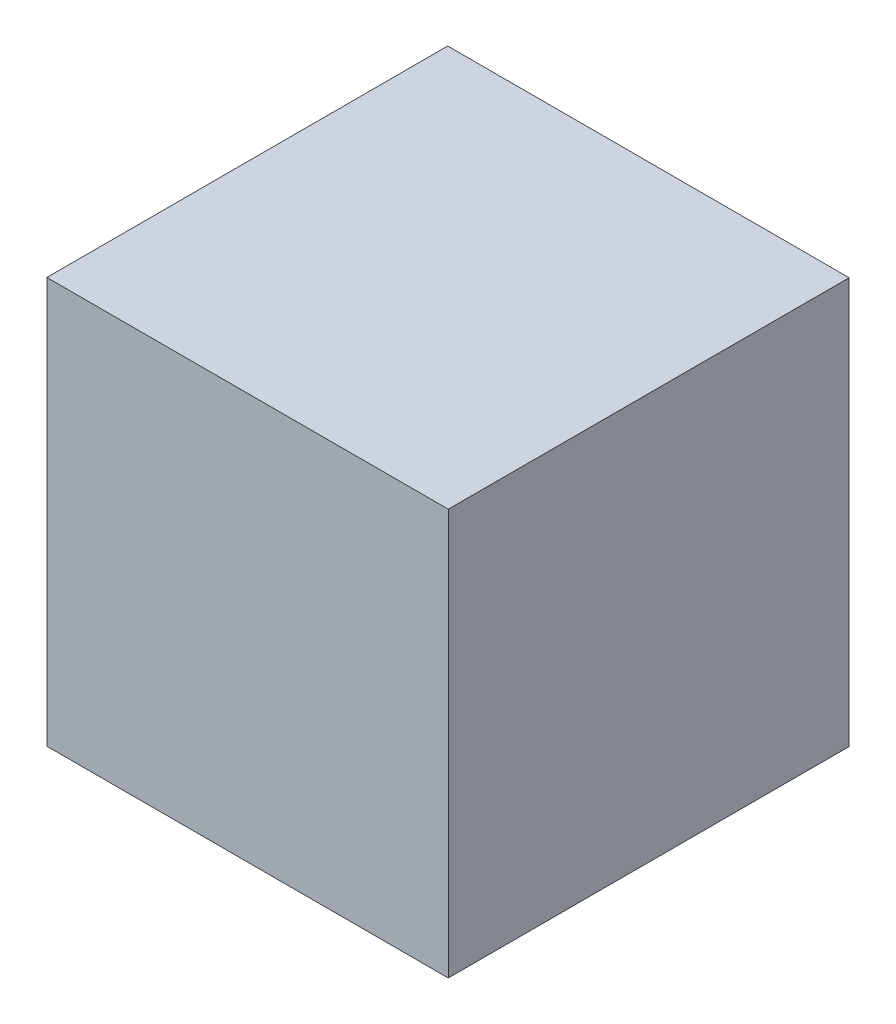
ISO-10303-21;
HEADER;
FILE_DESCRIPTION(('STEP AP214'),'2;1');
FILE_NAME('part.step','',(''),(''),'','','');
FILE_SCHEMA(('AUTOMOTIVE_DESIGN { 1 0 10303 214 1 1 1 1 }'));
ENDSEC;
DATA;
#1=APPLICATION_CONTEXT('core data for automotive mechanical design processes');
#2=APPLICATION_PROTOCOL_DEFINITION('international standard','automotive_design',2000,#1);
#3=PRODUCT_CONTEXT('',#1,'mechanical');
#4=PRODUCT('Part','Part','',(#3));
#5=PRODUCT_RELATED_PRODUCT_CATEGORY('part','',(#4));
#6=PRODUCT_DEFINITION_FORMATION('','',#4);
#7=PRODUCT_DEFINITION_CONTEXT('part definition',#1,'design');
#8=PRODUCT_DEFINITION('design','',#6,#7);
#9=PRODUCT_DEFINITION_SHAPE('','',#8);
#10=(LENGTH_UNIT() NAMED_UNIT(*) SI_UNIT(.MILLI.,.METRE.));
#11=(NAMED_UNIT(*) PLANE_ANGLE_UNIT() SI_UNIT($,.RADIAN.));
#12=(NAMED_UNIT(*) SI_UNIT($,.STERADIAN.) SOLID_ANGLE_UNIT());
#13=UNCERTAINTY_MEASURE_WITH_UNIT(LENGTH_MEASURE(1.E-05),#10,'distance_accuracy_value','');
#14=(GEOMETRIC_REPRESENTATION_CONTEXT(3) GLOBAL_UNCERTAINTY_ASSIGNED_CONTEXT((#13)) GLOBAL_UNIT_ASSIGNED_CONTEXT((#10,
#11,#12)) REPRESENTATION_CONTEXT('',''));
#15=CARTESIAN_POINT('',(0.,0.,0.));
#16=DIRECTION('',(0.,0.,1.));
#17=DIRECTION('',(1.,0.,0.));
#18=AXIS2_PLACEMENT_3D('',#15,#16,#17);
#19=CARTESIAN_POINT('',(-0.401828,-0.4064,0.8025384));
#20=DIRECTION('',(0.,0.,-1.));
#21=DIRECTION('',(-1.,0.,0.));
#22=AXIS2_PLACEMENT_3D('',#19,#20,#21);
#23=PLANE('',#22);
#24=DIRECTION('',(0.,1.,0.));
#25=VECTOR('',#24,1.);
#26=CARTESIAN_POINT('',(0.401828,-0.4064,0.8025384));
#27=LINE('',#26,#25);
#28=CARTESIAN_POINT('',(0.401828,-0.4064,0.8025384));
#29=VERTEX_POINT('',#28);
#30=CARTESIAN_POINT('',(0.401828,0.4064,0.8025384));
#31=VERTEX_POINT('',#30);
#32=EDGE_CURVE('E55',#29,#31,#27,.T.);
#33=ORIENTED_EDGE('',*,*,#32,.T.);
#34=DIRECTION('',(1.,0.,0.));
#35=VECTOR('',#34,1.);
#36=CARTESIAN_POINT('',(0.401828,0.4064,0.8025384));
#37=LINE('',#36,#35);
#38=CARTESIAN_POINT('',(-0.401828,0.4064,0.8025384));
#39=VERTEX_POINT('',#38);
#40=EDGE_CURVE('E57',#31,#39,#37,.F.);
#41=ORIENTED_EDGE('',*,*,#40,.T.);
#42=DIRECTION('',(0.,1.,0.));
#43=VECTOR('',#42,1.);
#44=CARTESIAN_POINT('',(-0.401828,0.4064,0.8025384));
#45=LINE('',#44,#43);
#46=CARTESIAN_POINT('',(-0.401828,-0.4064,0.8025384));
#47=VERTEX_POINT('',#46);
#48=EDGE_CURVE('E20',#39,#47,#45,.F.);
#49=ORIENTED_EDGE('',*,*,#48,.T.);
#50=DIRECTION('',(1.,0.,0.));
#51=VECTOR('',#50,1.);
#52=CARTESIAN_POINT('',(-0.401828,-0.4064,0.8025384));
#53=LINE('',#52,#51);
#54=EDGE_CURVE('E80',#47,#29,#53,.T.);
#55=ORIENTED_EDGE('',*,*,#54,.T.);
#56=EDGE_LOOP('',(#33,#41,#49,#55));
#57=FACE_BOUND('',#56,.T.);
#58=ADVANCED_FACE('F17',(#57),#23,.F.);
#59=CARTESIAN_POINT('',(-0.401828,0.4064,0.));
#60=DIRECTION('',(1.,0.,0.));
#61=DIRECTION('',(0.,0.,-1.));
#62=AXIS2_PLACEMENT_3D('',#59,#60,#61);
#63=PLANE('',#62);
#64=DIRECTION('',(0.,0.,1.));
#65=VECTOR('',#64,1.);
#66=CARTESIAN_POINT('',(-0.401828,-0.4064,0.));
#67=LINE('',#66,#65);
#68=CARTESIAN_POINT('',(-0.401828,-0.4064,0.));
#69=VERTEX_POINT('',#68);
#70=EDGE_CURVE('E68',#69,#47,#67,.T.);
#71=ORIENTED_EDGE('',*,*,#70,.T.);
#72=ORIENTED_EDGE('',*,*,#48,.F.);
#73=DIRECTION('',(0.,0.,-1.));
#74=VECTOR('',#73,1.);
#75=CARTESIAN_POINT('',(-0.401828,0.4064,0.));
#76=LINE('',#75,#74);
#77=CARTESIAN_POINT('',(-0.401828,0.4064,0.));
#78=VERTEX_POINT('',#77);
#79=EDGE_CURVE('E63',#39,#78,#76,.T.);
#80=ORIENTED_EDGE('',*,*,#79,.T.);
#81=DIRECTION('',(0.,1.,0.));
#82=VECTOR('',#81,1.);
#83=CARTESIAN_POINT('',(-0.401828,-0.4064,0.));
#84=LINE('',#83,#82);
#85=EDGE_CURVE('E83',#69,#78,#84,.T.);
#86=ORIENTED_EDGE('',*,*,#85,.F.);
#87=EDGE_LOOP('',(#71,#72,#80,#86));
#88=FACE_BOUND('',#87,.T.);
#89=ADVANCED_FACE('F65',(#88),#63,.F.);
#90=CARTESIAN_POINT('',(0.401828,0.4064,0.));
#91=DIRECTION('',(0.,-1.,0.));
#92=DIRECTION('',(0.,0.,-1.));
#93=AXIS2_PLACEMENT_3D('',#90,#91,#92);
#94=PLANE('',#93);
#95=ORIENTED_EDGE('',*,*,#79,.F.);
#96=ORIENTED_EDGE('',*,*,#40,.F.);
#97=DIRECTION('',(0.,0.,1.));
#98=VECTOR('',#97,1.);
#99=CARTESIAN_POINT('',(0.401828,0.4064,0.));
#100=LINE('',#99,#98);
#101=CARTESIAN_POINT('',(0.401828,0.4064,0.));
#102=VERTEX_POINT('',#101);
#103=EDGE_CURVE('E75',#31,#102,#100,.F.);
#104=ORIENTED_EDGE('',*,*,#103,.T.);
#105=DIRECTION('',(-1.,0.,0.));
#106=VECTOR('',#105,1.);
#107=CARTESIAN_POINT('',(-0.401828,0.4064,0.));
#108=LINE('',#107,#106);
#109=EDGE_CURVE('E72',#78,#102,#108,.F.);
#110=ORIENTED_EDGE('',*,*,#109,.F.);
#111=EDGE_LOOP('',(#95,#96,#104,#110));
#112=FACE_BOUND('',#111,.T.);
#113=ADVANCED_FACE('F70',(#112),#94,.F.);
#114=CARTESIAN_POINT('',(0.401828,-0.4064,0.));
#115=DIRECTION('',(-1.,0.,0.));
#116=DIRECTION('',(0.,0.,1.));
#117=AXIS2_PLACEMENT_3D('',#114,#115,#116);
#118=PLANE('',#117);
#119=ORIENTED_EDGE('',*,*,#103,.F.);
#120=ORIENTED_EDGE('',*,*,#32,.F.);
#121=DIRECTION('',(0.,0.,1.));
#122=VECTOR('',#121,1.);
#123=CARTESIAN_POINT('',(0.401828,-0.4064,0.));
#124=LINE('',#123,#122);
#125=CARTESIAN_POINT('',(0.401828,-0.4064,0.));
#126=VERTEX_POINT('',#125);
#127=EDGE_CURVE('E35',#29,#126,#124,.F.);
#128=ORIENTED_EDGE('',*,*,#127,.T.);
#129=DIRECTION('',(0.,1.,0.));
#130=VECTOR('',#129,1.);
#131=CARTESIAN_POINT('',(0.401828,-0.4064,0.));
#132=LINE('',#131,#130);
#133=EDGE_CURVE('E26',#102,#126,#132,.F.);
#134=ORIENTED_EDGE('',*,*,#133,.F.);
#135=EDGE_LOOP('',(#119,#120,#128,#134));
#136=FACE_BOUND('',#135,.T.);
#137=ADVANCED_FACE('F89',(#136),#118,.F.);
#138=CARTESIAN_POINT('',(-0.401828,-0.4064,0.));
#139=DIRECTION('',(0.,1.,0.));
#140=DIRECTION('',(0.,0.,1.));
#141=AXIS2_PLACEMENT_3D('',#138,#139,#140);
#142=PLANE('',#141);
#143=ORIENTED_EDGE('',*,*,#127,.F.);
#144=ORIENTED_EDGE('',*,*,#54,.F.);
#145=ORIENTED_EDGE('',*,*,#70,.F.);
#146=DIRECTION('',(-1.,0.,0.));
#147=VECTOR('',#146,1.);
#148=CARTESIAN_POINT('',(-0.401828,-0.4064,0.));
#149=LINE('',#148,#147);
#150=EDGE_CURVE('E11',#126,#69,#149,.T.);
#151=ORIENTED_EDGE('',*,*,#150,.F.);
#152=EDGE_LOOP('',(#143,#144,#145,#151));
#153=FACE_BOUND('',#152,.T.);
#154=ADVANCED_FACE('F91',(#153),#142,.F.);
#155=CARTESIAN_POINT('',(-0.401828,-0.4064,0.));
#156=DIRECTION('',(0.,0.,-1.));
#157=DIRECTION('',(-1.,0.,0.));
#158=AXIS2_PLACEMENT_3D('',#155,#156,#157);
#159=PLANE('',#158);
#160=ORIENTED_EDGE('',*,*,#133,.T.);
#161=ORIENTED_EDGE('',*,*,#150,.T.);
#162=ORIENTED_EDGE('',*,*,#85,.T.);
#163=ORIENTED_EDGE('',*,*,#109,.T.);
#164=EDGE_LOOP('',(#160,#161,#162,#163));
#165=FACE_BOUND('',#164,.T.);
#166=ADVANCED_FACE('F88',(#165),#159,.T.);
#167=CLOSED_SHELL('',(#58,#89,#113,#137,#154,#166));
#168=MANIFOLD_SOLID_BREP('B1',#167);
#169=ADVANCED_BREP_SHAPE_REPRESENTATION('',(#18,#168),#14);
#170=SHAPE_DEFINITION_REPRESENTATION(#9,#169);
ENDSEC;
END-ISO-10303-21;
